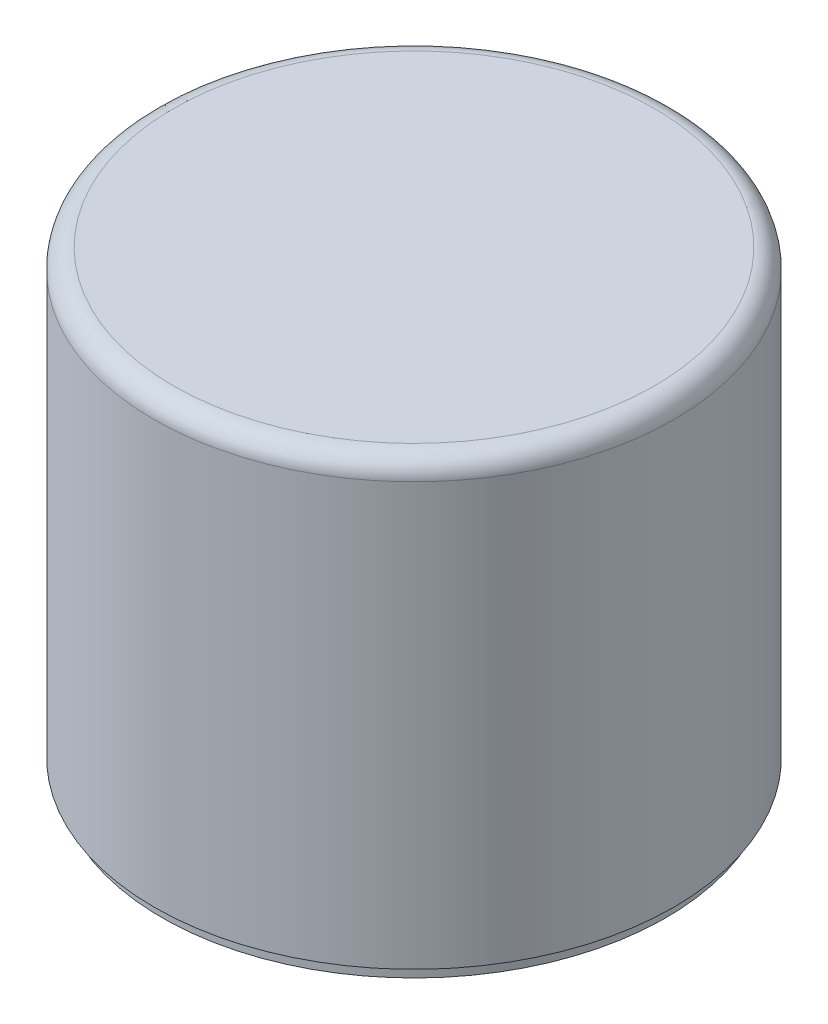
ISO-10303-21;
HEADER;
FILE_DESCRIPTION(('STEP AP214'),'2;1');
FILE_NAME('part.step','',(''),(''),'','','');
FILE_SCHEMA(('AUTOMOTIVE_DESIGN { 1 0 10303 214 1 1 1 1 }'));
ENDSEC;
DATA;
#1=APPLICATION_CONTEXT('core data for automotive mechanical design processes');
#2=APPLICATION_PROTOCOL_DEFINITION('international standard','automotive_design',2000,#1);
#3=PRODUCT_CONTEXT('',#1,'mechanical');
#4=PRODUCT('Part','Part','',(#3));
#5=PRODUCT_RELATED_PRODUCT_CATEGORY('part','',(#4));
#6=PRODUCT_DEFINITION_FORMATION('','',#4);
#7=PRODUCT_DEFINITION_CONTEXT('part definition',#1,'design');
#8=PRODUCT_DEFINITION('design','',#6,#7);
#9=PRODUCT_DEFINITION_SHAPE('','',#8);
#10=(LENGTH_UNIT() NAMED_UNIT(*) SI_UNIT(.MILLI.,.METRE.));
#11=(NAMED_UNIT(*) PLANE_ANGLE_UNIT() SI_UNIT($,.RADIAN.));
#12=(NAMED_UNIT(*) SI_UNIT($,.STERADIAN.) SOLID_ANGLE_UNIT());
#13=UNCERTAINTY_MEASURE_WITH_UNIT(LENGTH_MEASURE(1.E-05),#10,'distance_accuracy_value','');
#14=(GEOMETRIC_REPRESENTATION_CONTEXT(3) GLOBAL_UNCERTAINTY_ASSIGNED_CONTEXT((#13)) GLOBAL_UNIT_ASSIGNED_CONTEXT((#10,
#11,#12)) REPRESENTATION_CONTEXT('',''));
#15=CARTESIAN_POINT('',(0.,0.,0.));
#16=DIRECTION('',(0.,0.,1.));
#17=DIRECTION('',(1.,0.,0.));
#18=AXIS2_PLACEMENT_3D('',#15,#16,#17);
#19=CARTESIAN_POINT('',(0.,0.,0.));
#20=DIRECTION('',(0.,1.,0.));
#21=DIRECTION('',(0.,0.,1.));
#22=AXIS2_PLACEMENT_3D('',#19,#20,#21);
#23=PLANE('',#22);
#24=CARTESIAN_POINT('',(0.,0.,0.));
#25=DIRECTION('',(0.,1.,0.));
#26=DIRECTION('',(0.,0.,1.));
#27=AXIS2_PLACEMENT_3D('',#24,#25,#26);
#28=CIRCLE('',#27,38.);
#29=CARTESIAN_POINT('',(0.,0.,38.));
#30=VERTEX_POINT('',#29);
#31=EDGE_CURVE('E55',#30,#30,#28,.T.);
#32=ORIENTED_EDGE('',*,*,#31,.T.);
#33=EDGE_LOOP('',(#32));
#34=FACE_BOUND('',#33,.T.);
#35=CARTESIAN_POINT('',(0.,0.,0.));
#36=DIRECTION('',(0.,-1.,0.));
#37=DIRECTION('',(0.,0.,-1.));
#38=AXIS2_PLACEMENT_3D('',#35,#36,#37);
#39=CIRCLE('',#38,38.8);
#40=CARTESIAN_POINT('',(0.,0.,-38.8));
#41=VERTEX_POINT('',#40);
#42=EDGE_CURVE('E66',#41,#41,#39,.T.);
#43=ORIENTED_EDGE('',*,*,#42,.T.);
#44=EDGE_LOOP('',(#43));
#45=FACE_BOUND('',#44,.T.);
#46=ADVANCED_FACE('F37',(#34,#45),#23,.F.);
#47=CARTESIAN_POINT('',(0.,70.,0.));
#48=DIRECTION('',(0.,-1.,0.));
#49=DIRECTION('',(0.,0.,-1.));
#50=AXIS2_PLACEMENT_3D('',#47,#48,#49);
#51=CYLINDRICAL_SURFACE('',#50,38.);
#52=CARTESIAN_POINT('',(0.,68.,0.));
#53=DIRECTION('',(0.,1.,0.));
#54=DIRECTION('',(0.,0.,1.));
#55=AXIS2_PLACEMENT_3D('',#52,#53,#54);
#56=CIRCLE('',#55,38.);
#57=CARTESIAN_POINT('',(0.,68.,38.));
#58=VERTEX_POINT('',#57);
#59=EDGE_CURVE('E50',#58,#58,#56,.T.);
#60=ORIENTED_EDGE('',*,*,#59,.T.);
#61=EDGE_LOOP('',(#60));
#62=FACE_BOUND('',#61,.T.);
#63=ORIENTED_EDGE('',*,*,#31,.F.);
#64=EDGE_LOOP('',(#63));
#65=FACE_BOUND('',#64,.T.);
#66=ADVANCED_FACE('F95',(#62,#65),#51,.F.);
#67=CARTESIAN_POINT('',(0.,68.,0.));
#68=DIRECTION('',(0.,1.,0.));
#69=DIRECTION('',(0.,0.,1.));
#70=AXIS2_PLACEMENT_3D('',#67,#68,#69);
#71=PLANE('',#70);
#72=ORIENTED_EDGE('',*,*,#59,.F.);
#73=EDGE_LOOP('',(#72));
#74=FACE_BOUND('',#73,.T.);
#75=ADVANCED_FACE('F80',(#74),#71,.F.);
#76=CARTESIAN_POINT('',(0.,2.,0.));
#77=DIRECTION('',(0.,-1.,0.));
#78=DIRECTION('',(0.,0.,-1.));
#79=AXIS2_PLACEMENT_3D('',#76,#77,#78);
#80=PLANE('',#79);
#81=CARTESIAN_POINT('',(0.,2.,0.));
#82=DIRECTION('',(0.,-1.,0.));
#83=DIRECTION('',(0.,0.,-1.));
#84=AXIS2_PLACEMENT_3D('',#81,#82,#83);
#85=CIRCLE('',#84,38.8);
#86=CARTESIAN_POINT('',(0.,2.,-38.8));
#87=VERTEX_POINT('',#86);
#88=EDGE_CURVE('E65',#87,#87,#85,.T.);
#89=ORIENTED_EDGE('',*,*,#88,.F.);
#90=EDGE_LOOP('',(#89));
#91=FACE_BOUND('',#90,.T.);
#92=CARTESIAN_POINT('',(0.,2.,0.));
#93=DIRECTION('',(0.,-1.,0.));
#94=DIRECTION('',(0.,0.,-1.));
#95=AXIS2_PLACEMENT_3D('',#92,#93,#94);
#96=CIRCLE('',#95,40.);
#97=CARTESIAN_POINT('',(0.,2.,-40.));
#98=VERTEX_POINT('',#97);
#99=EDGE_CURVE('E60',#98,#98,#96,.T.);
#100=ORIENTED_EDGE('',*,*,#99,.T.);
#101=EDGE_LOOP('',(#100));
#102=FACE_BOUND('',#101,.T.);
#103=ADVANCED_FACE('F77',(#91,#102),#80,.T.);
#104=CARTESIAN_POINT('',(0.,2.,0.));
#105=DIRECTION('',(0.,-1.,0.));
#106=DIRECTION('',(0.,0.,-1.));
#107=AXIS2_PLACEMENT_3D('',#104,#105,#106);
#108=CYLINDRICAL_SURFACE('',#107,38.8);
#109=ORIENTED_EDGE('',*,*,#88,.T.);
#110=EDGE_LOOP('',(#109));
#111=FACE_BOUND('',#110,.T.);
#112=ORIENTED_EDGE('',*,*,#42,.F.);
#113=EDGE_LOOP('',(#112));
#114=FACE_BOUND('',#113,.T.);
#115=ADVANCED_FACE('F74',(#111,#114),#108,.T.);
#116=CARTESIAN_POINT('',(0.,70.,0.));
#117=DIRECTION('',(0.,1.,0.));
#118=DIRECTION('',(0.,0.,1.));
#119=AXIS2_PLACEMENT_3D('',#116,#117,#118);
#120=PLANE('',#119);
#121=CARTESIAN_POINT('',(0.,70.,0.));
#122=DIRECTION('',(0.,1.,0.));
#123=DIRECTION('',(0.,0.,1.));
#124=AXIS2_PLACEMENT_3D('',#121,#122,#123);
#125=CIRCLE('',#124,37.);
#126=CARTESIAN_POINT('',(0.,70.,37.));
#127=VERTEX_POINT('',#126);
#128=EDGE_CURVE('E45',#127,#127,#125,.T.);
#129=ORIENTED_EDGE('',*,*,#128,.T.);
#130=EDGE_LOOP('',(#129));
#131=FACE_BOUND('',#130,.T.);
#132=ADVANCED_FACE('F86',(#131),#120,.T.);
#133=CARTESIAN_POINT('',(0.,70.,0.));
#134=DIRECTION('',(0.,-1.,0.));
#135=DIRECTION('',(0.,0.,-1.));
#136=AXIS2_PLACEMENT_3D('',#133,#134,#135);
#137=CYLINDRICAL_SURFACE('',#136,40.);
#138=CARTESIAN_POINT('',(0.,67.,0.));
#139=DIRECTION('',(0.,1.,0.));
#140=DIRECTION('',(0.,0.,1.));
#141=AXIS2_PLACEMENT_3D('',#138,#139,#140);
#142=CIRCLE('',#141,40.);
#143=CARTESIAN_POINT('',(0.,67.,40.));
#144=VERTEX_POINT('',#143);
#145=EDGE_CURVE('E10',#144,#144,#142,.F.);
#146=ORIENTED_EDGE('',*,*,#145,.T.);
#147=EDGE_LOOP('',(#146));
#148=FACE_BOUND('',#147,.T.);
#149=ORIENTED_EDGE('',*,*,#99,.F.);
#150=EDGE_LOOP('',(#149));
#151=FACE_BOUND('',#150,.T.);
#152=ADVANCED_FACE('F84',(#148,#151),#137,.T.);
#153=CARTESIAN_POINT('',(0.,67.,0.));
#154=DIRECTION('',(0.,1.,0.));
#155=DIRECTION('',(0.,0.,1.));
#156=AXIS2_PLACEMENT_3D('',#153,#154,#155);
#157=TOROIDAL_SURFACE('',#156,37.,3.);
#158=ORIENTED_EDGE('',*,*,#145,.F.);
#159=EDGE_LOOP('',(#158));
#160=FACE_BOUND('',#159,.T.);
#161=ORIENTED_EDGE('',*,*,#128,.F.);
#162=EDGE_LOOP('',(#161));
#163=FACE_BOUND('',#162,.T.);
#164=ADVANCED_FACE('F39',(#160,#163),#157,.T.);
#165=CLOSED_SHELL('',(#46,#66,#75,#103,#115,#132,#152,#164));
#166=MANIFOLD_SOLID_BREP('B2',#165);
#167=ADVANCED_BREP_SHAPE_REPRESENTATION('',(#18,#166),#14);
#168=SHAPE_DEFINITION_REPRESENTATION(#9,#167);
ENDSEC;
END-ISO-10303-21;
